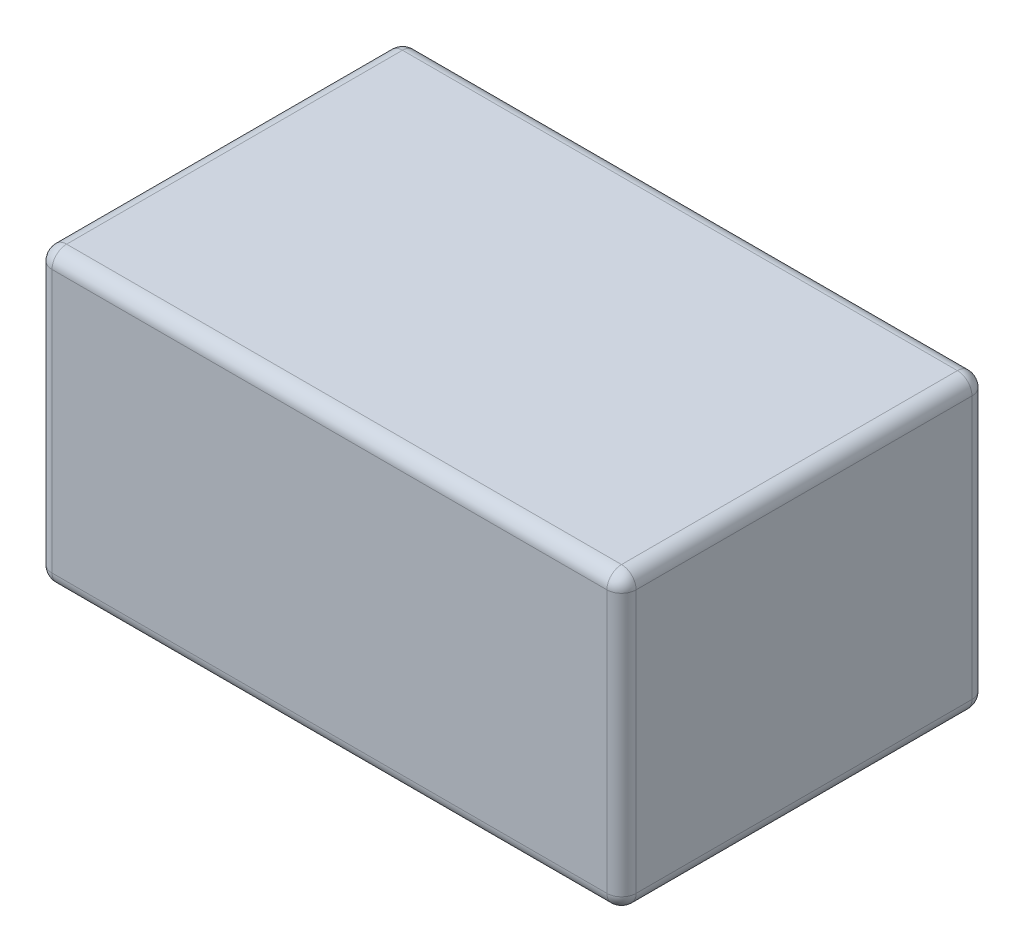
ISO-10303-21;
HEADER;
FILE_DESCRIPTION(('STEP AP214'),'2;1');
FILE_NAME('part.step','',(''),(''),'','','');
FILE_SCHEMA(('AUTOMOTIVE_DESIGN { 1 0 10303 214 1 1 1 1 }'));
ENDSEC;
DATA;
#1=APPLICATION_CONTEXT('core data for automotive mechanical design processes');
#2=APPLICATION_PROTOCOL_DEFINITION('international standard','automotive_design',2000,#1);
#3=PRODUCT_CONTEXT('',#1,'mechanical');
#4=PRODUCT('Part','Part','',(#3));
#5=PRODUCT_RELATED_PRODUCT_CATEGORY('part','',(#4));
#6=PRODUCT_DEFINITION_FORMATION('','',#4);
#7=PRODUCT_DEFINITION_CONTEXT('part definition',#1,'design');
#8=PRODUCT_DEFINITION('design','',#6,#7);
#9=PRODUCT_DEFINITION_SHAPE('','',#8);
#10=(LENGTH_UNIT() NAMED_UNIT(*) SI_UNIT(.MILLI.,.METRE.));
#11=(NAMED_UNIT(*) PLANE_ANGLE_UNIT() SI_UNIT($,.RADIAN.));
#12=(NAMED_UNIT(*) SI_UNIT($,.STERADIAN.) SOLID_ANGLE_UNIT());
#13=UNCERTAINTY_MEASURE_WITH_UNIT(LENGTH_MEASURE(1.E-05),#10,'distance_accuracy_value','');
#14=(GEOMETRIC_REPRESENTATION_CONTEXT(3) GLOBAL_UNCERTAINTY_ASSIGNED_CONTEXT((#13)) GLOBAL_UNIT_ASSIGNED_CONTEXT((#10,
#11,#12)) REPRESENTATION_CONTEXT('',''));
#15=CARTESIAN_POINT('',(0.,0.,0.));
#16=DIRECTION('',(0.,0.,1.));
#17=DIRECTION('',(1.,0.,0.));
#18=AXIS2_PLACEMENT_3D('',#15,#16,#17);
#19=CARTESIAN_POINT('',(40.,40.,-25.));
#20=DIRECTION('',(-1.,0.,0.));
#21=DIRECTION('',(0.,0.,1.));
#22=AXIS2_PLACEMENT_3D('',#19,#20,#21);
#23=PLANE('',#22);
#24=DIRECTION('',(0.,0.,-1.));
#25=VECTOR('',#24,1.);
#26=CARTESIAN_POINT('',(40.,2.,-25.));
#27=LINE('',#26,#25);
#28=CARTESIAN_POINT('',(40.,2.,23.));
#29=VERTEX_POINT('',#28);
#30=CARTESIAN_POINT('',(40.,2.,-23.));
#31=VERTEX_POINT('',#30);
#32=EDGE_CURVE('E169',#29,#31,#27,.T.);
#33=ORIENTED_EDGE('',*,*,#32,.T.);
#34=DIRECTION('',(0.,-1.,0.));
#35=VECTOR('',#34,1.);
#36=CARTESIAN_POINT('',(40.,40.,-23.));
#37=LINE('',#36,#35);
#38=CARTESIAN_POINT('',(40.,38.,-23.));
#39=VERTEX_POINT('',#38);
#40=EDGE_CURVE('E171',#31,#39,#37,.F.);
#41=ORIENTED_EDGE('',*,*,#40,.T.);
#42=DIRECTION('',(0.,0.,-1.));
#43=VECTOR('',#42,1.);
#44=CARTESIAN_POINT('',(40.,38.,25.));
#45=LINE('',#44,#43);
#46=CARTESIAN_POINT('',(40.,38.,23.));
#47=VERTEX_POINT('',#46);
#48=EDGE_CURVE('E165',#39,#47,#45,.F.);
#49=ORIENTED_EDGE('',*,*,#48,.T.);
#50=DIRECTION('',(0.,-1.,0.));
#51=VECTOR('',#50,1.);
#52=CARTESIAN_POINT('',(40.,40.,23.));
#53=LINE('',#52,#51);
#54=EDGE_CURVE('E167',#47,#29,#53,.T.);
#55=ORIENTED_EDGE('',*,*,#54,.T.);
#56=EDGE_LOOP('',(#33,#41,#49,#55));
#57=FACE_BOUND('',#56,.T.);
#58=ADVANCED_FACE('F34',(#57),#23,.F.);
#59=CARTESIAN_POINT('',(-40.,40.,-25.));
#60=DIRECTION('',(0.,0.,1.));
#61=DIRECTION('',(1.,0.,0.));
#62=AXIS2_PLACEMENT_3D('',#59,#60,#61);
#63=PLANE('',#62);
#64=DIRECTION('',(-1.,0.,0.));
#65=VECTOR('',#64,1.);
#66=CARTESIAN_POINT('',(40.,38.,-25.));
#67=LINE('',#66,#65);
#68=CARTESIAN_POINT('',(-38.,38.,-25.));
#69=VERTEX_POINT('',#68);
#70=CARTESIAN_POINT('',(38.,38.,-25.));
#71=VERTEX_POINT('',#70);
#72=EDGE_CURVE('E126',#69,#71,#67,.F.);
#73=ORIENTED_EDGE('',*,*,#72,.T.);
#74=DIRECTION('',(0.,-1.,0.));
#75=VECTOR('',#74,1.);
#76=CARTESIAN_POINT('',(38.,40.,-25.));
#77=LINE('',#76,#75);
#78=CARTESIAN_POINT('',(38.,2.,-25.));
#79=VERTEX_POINT('',#78);
#80=EDGE_CURVE('E163',#71,#79,#77,.T.);
#81=ORIENTED_EDGE('',*,*,#80,.T.);
#82=DIRECTION('',(-1.,0.,0.));
#83=VECTOR('',#82,1.);
#84=CARTESIAN_POINT('',(-40.,2.,-25.));
#85=LINE('',#84,#83);
#86=CARTESIAN_POINT('',(-38.,2.,-25.));
#87=VERTEX_POINT('',#86);
#88=EDGE_CURVE('E129',#79,#87,#85,.T.);
#89=ORIENTED_EDGE('',*,*,#88,.T.);
#90=DIRECTION('',(0.,-1.,0.));
#91=VECTOR('',#90,1.);
#92=CARTESIAN_POINT('',(-38.,40.,-25.));
#93=LINE('',#92,#91);
#94=EDGE_CURVE('E121',#87,#69,#93,.F.);
#95=ORIENTED_EDGE('',*,*,#94,.T.);
#96=EDGE_LOOP('',(#73,#81,#89,#95));
#97=FACE_BOUND('',#96,.T.);
#98=ADVANCED_FACE('F123',(#97),#63,.F.);
#99=CARTESIAN_POINT('',(-40.,40.,-25.));
#100=DIRECTION('',(1.,0.,0.));
#101=DIRECTION('',(0.,0.,-1.));
#102=AXIS2_PLACEMENT_3D('',#99,#100,#101);
#103=PLANE('',#102);
#104=DIRECTION('',(0.,0.,1.));
#105=VECTOR('',#104,1.);
#106=CARTESIAN_POINT('',(-40.,38.,-25.));
#107=LINE('',#106,#105);
#108=CARTESIAN_POINT('',(-40.,38.,23.));
#109=VERTEX_POINT('',#108);
#110=CARTESIAN_POINT('',(-40.,38.,-23.));
#111=VERTEX_POINT('',#110);
#112=EDGE_CURVE('E183',#109,#111,#107,.F.);
#113=ORIENTED_EDGE('',*,*,#112,.T.);
#114=DIRECTION('',(0.,-1.,0.));
#115=VECTOR('',#114,1.);
#116=CARTESIAN_POINT('',(-40.,40.,-23.));
#117=LINE('',#116,#115);
#118=CARTESIAN_POINT('',(-40.,2.,-23.));
#119=VERTEX_POINT('',#118);
#120=EDGE_CURVE('E140',#111,#119,#117,.T.);
#121=ORIENTED_EDGE('',*,*,#120,.T.);
#122=DIRECTION('',(0.,0.,1.));
#123=VECTOR('',#122,1.);
#124=CARTESIAN_POINT('',(-40.,2.,-25.));
#125=LINE('',#124,#123);
#126=CARTESIAN_POINT('',(-40.,2.,23.));
#127=VERTEX_POINT('',#126);
#128=EDGE_CURVE('E187',#119,#127,#125,.T.);
#129=ORIENTED_EDGE('',*,*,#128,.T.);
#130=DIRECTION('',(0.,-1.,0.));
#131=VECTOR('',#130,1.);
#132=CARTESIAN_POINT('',(-40.,40.,23.));
#133=LINE('',#132,#131);
#134=EDGE_CURVE('E185',#127,#109,#133,.F.);
#135=ORIENTED_EDGE('',*,*,#134,.T.);
#136=EDGE_LOOP('',(#113,#121,#129,#135));
#137=FACE_BOUND('',#136,.T.);
#138=ADVANCED_FACE('F325',(#137),#103,.F.);
#139=CARTESIAN_POINT('',(-40.,40.,25.));
#140=DIRECTION('',(0.,0.,-1.));
#141=DIRECTION('',(-1.,0.,0.));
#142=AXIS2_PLACEMENT_3D('',#139,#140,#141);
#143=PLANE('',#142);
#144=DIRECTION('',(0.,-1.,0.));
#145=VECTOR('',#144,1.);
#146=CARTESIAN_POINT('',(-38.,40.,25.));
#147=LINE('',#146,#145);
#148=CARTESIAN_POINT('',(-38.,38.,25.));
#149=VERTEX_POINT('',#148);
#150=CARTESIAN_POINT('',(-38.,2.,25.));
#151=VERTEX_POINT('',#150);
#152=EDGE_CURVE('E194',#149,#151,#147,.T.);
#153=ORIENTED_EDGE('',*,*,#152,.T.);
#154=DIRECTION('',(1.,0.,0.));
#155=VECTOR('',#154,1.);
#156=CARTESIAN_POINT('',(-40.,2.,25.));
#157=LINE('',#156,#155);
#158=CARTESIAN_POINT('',(38.,2.,25.));
#159=VERTEX_POINT('',#158);
#160=EDGE_CURVE('E197',#151,#159,#157,.T.);
#161=ORIENTED_EDGE('',*,*,#160,.T.);
#162=DIRECTION('',(0.,-1.,0.));
#163=VECTOR('',#162,1.);
#164=CARTESIAN_POINT('',(38.,40.,25.));
#165=LINE('',#164,#163);
#166=CARTESIAN_POINT('',(38.,38.,25.));
#167=VERTEX_POINT('',#166);
#168=EDGE_CURVE('E192',#159,#167,#165,.F.);
#169=ORIENTED_EDGE('',*,*,#168,.T.);
#170=DIRECTION('',(1.,0.,0.));
#171=VECTOR('',#170,1.);
#172=CARTESIAN_POINT('',(-40.,38.,25.));
#173=LINE('',#172,#171);
#174=EDGE_CURVE('E190',#167,#149,#173,.F.);
#175=ORIENTED_EDGE('',*,*,#174,.T.);
#176=EDGE_LOOP('',(#153,#161,#169,#175));
#177=FACE_BOUND('',#176,.T.);
#178=ADVANCED_FACE('F274',(#177),#143,.F.);
#179=CARTESIAN_POINT('',(0.,40.,0.));
#180=DIRECTION('',(0.,1.,0.));
#181=DIRECTION('',(0.,0.,1.));
#182=AXIS2_PLACEMENT_3D('',#179,#180,#181);
#183=PLANE('',#182);
#184=DIRECTION('',(0.,0.,1.));
#185=VECTOR('',#184,1.);
#186=CARTESIAN_POINT('',(-38.,40.,25.));
#187=LINE('',#186,#185);
#188=CARTESIAN_POINT('',(-38.,40.,-23.));
#189=VERTEX_POINT('',#188);
#190=CARTESIAN_POINT('',(-38.,40.,23.));
#191=VERTEX_POINT('',#190);
#192=EDGE_CURVE('E43',#189,#191,#187,.T.);
#193=ORIENTED_EDGE('',*,*,#192,.T.);
#194=DIRECTION('',(1.,0.,0.));
#195=VECTOR('',#194,1.);
#196=CARTESIAN_POINT('',(40.,40.,23.));
#197=LINE('',#196,#195);
#198=CARTESIAN_POINT('',(38.,40.,23.));
#199=VERTEX_POINT('',#198);
#200=EDGE_CURVE('E11',#191,#199,#197,.T.);
#201=ORIENTED_EDGE('',*,*,#200,.T.);
#202=DIRECTION('',(0.,0.,-1.));
#203=VECTOR('',#202,1.);
#204=CARTESIAN_POINT('',(38.,40.,-25.));
#205=LINE('',#204,#203);
#206=CARTESIAN_POINT('',(38.,40.,-23.));
#207=VERTEX_POINT('',#206);
#208=EDGE_CURVE('E199',#199,#207,#205,.T.);
#209=ORIENTED_EDGE('',*,*,#208,.T.);
#210=DIRECTION('',(-1.,0.,0.));
#211=VECTOR('',#210,1.);
#212=CARTESIAN_POINT('',(-40.,40.,-23.));
#213=LINE('',#212,#211);
#214=EDGE_CURVE('E54',#207,#189,#213,.T.);
#215=ORIENTED_EDGE('',*,*,#214,.T.);
#216=EDGE_LOOP('',(#193,#201,#209,#215));
#217=FACE_BOUND('',#216,.T.);
#218=ADVANCED_FACE('F289',(#217),#183,.T.);
#219=CARTESIAN_POINT('',(0.,0.,0.));
#220=DIRECTION('',(0.,1.,0.));
#221=DIRECTION('',(0.,0.,1.));
#222=AXIS2_PLACEMENT_3D('',#219,#220,#221);
#223=PLANE('',#222);
#224=DIRECTION('',(0.,0.,1.));
#225=VECTOR('',#224,1.);
#226=CARTESIAN_POINT('',(-38.,0.,0.));
#227=LINE('',#226,#225);
#228=CARTESIAN_POINT('',(-38.,0.,23.));
#229=VERTEX_POINT('',#228);
#230=CARTESIAN_POINT('',(-38.,0.,-23.));
#231=VERTEX_POINT('',#230);
#232=EDGE_CURVE('E176',#229,#231,#227,.F.);
#233=ORIENTED_EDGE('',*,*,#232,.T.);
#234=DIRECTION('',(-1.,0.,0.));
#235=VECTOR('',#234,1.);
#236=CARTESIAN_POINT('',(0.,0.,-23.));
#237=LINE('',#236,#235);
#238=CARTESIAN_POINT('',(38.,0.,-23.));
#239=VERTEX_POINT('',#238);
#240=EDGE_CURVE('E180',#231,#239,#237,.F.);
#241=ORIENTED_EDGE('',*,*,#240,.T.);
#242=DIRECTION('',(0.,0.,-1.));
#243=VECTOR('',#242,1.);
#244=CARTESIAN_POINT('',(38.,0.,0.));
#245=LINE('',#244,#243);
#246=CARTESIAN_POINT('',(38.,0.,23.));
#247=VERTEX_POINT('',#246);
#248=EDGE_CURVE('E178',#239,#247,#245,.F.);
#249=ORIENTED_EDGE('',*,*,#248,.T.);
#250=DIRECTION('',(1.,0.,0.));
#251=VECTOR('',#250,1.);
#252=CARTESIAN_POINT('',(0.,0.,23.));
#253=LINE('',#252,#251);
#254=EDGE_CURVE('E174',#247,#229,#253,.F.);
#255=ORIENTED_EDGE('',*,*,#254,.T.);
#256=EDGE_LOOP('',(#233,#241,#249,#255));
#257=FACE_BOUND('',#256,.T.);
#258=ADVANCED_FACE('F265',(#257),#223,.F.);
#259=CARTESIAN_POINT('',(-38.,40.,23.));
#260=DIRECTION('',(0.,-1.,0.));
#261=DIRECTION('',(0.,0.,-1.));
#262=AXIS2_PLACEMENT_3D('',#259,#260,#261);
#263=CYLINDRICAL_SURFACE('',#262,2.);
#264=CARTESIAN_POINT('',(-38.,38.,23.));
#265=DIRECTION('',(0.,1.,0.));
#266=DIRECTION('',(0.,0.,1.));
#267=AXIS2_PLACEMENT_3D('',#264,#265,#266);
#268=CIRCLE('',#267,2.);
#269=EDGE_CURVE('E38',#109,#149,#268,.T.);
#270=ORIENTED_EDGE('',*,*,#269,.F.);
#271=ORIENTED_EDGE('',*,*,#134,.F.);
#272=CARTESIAN_POINT('',(-38.,2.,23.));
#273=DIRECTION('',(0.,-1.,0.));
#274=DIRECTION('',(0.,0.,-1.));
#275=AXIS2_PLACEMENT_3D('',#272,#273,#274);
#276=CIRCLE('',#275,2.);
#277=EDGE_CURVE('E160',#151,#127,#276,.T.);
#278=ORIENTED_EDGE('',*,*,#277,.F.);
#279=ORIENTED_EDGE('',*,*,#152,.F.);
#280=EDGE_LOOP('',(#270,#271,#278,#279));
#281=FACE_BOUND('',#280,.T.);
#282=ADVANCED_FACE('F36',(#281),#263,.T.);
#283=CARTESIAN_POINT('',(-38.,38.,23.));
#284=DIRECTION('',(0.,0.,1.));
#285=DIRECTION('',(1.,0.,0.));
#286=AXIS2_PLACEMENT_3D('',#283,#284,#285);
#287=SPHERICAL_SURFACE('',#286,2.);
#288=CARTESIAN_POINT('',(-38.,38.,23.));
#289=DIRECTION('',(0.,0.,1.));
#290=DIRECTION('',(1.,0.,0.));
#291=AXIS2_PLACEMENT_3D('',#288,#289,#290);
#292=CIRCLE('',#291,2.);
#293=EDGE_CURVE('E245',#109,#191,#292,.F.);
#294=ORIENTED_EDGE('',*,*,#293,.F.);
#295=ORIENTED_EDGE('',*,*,#269,.T.);
#296=CARTESIAN_POINT('',(-38.,38.,23.));
#297=DIRECTION('',(-1.,0.,0.));
#298=DIRECTION('',(0.,0.,1.));
#299=AXIS2_PLACEMENT_3D('',#296,#297,#298);
#300=CIRCLE('',#299,2.);
#301=EDGE_CURVE('E247',#191,#149,#300,.F.);
#302=ORIENTED_EDGE('',*,*,#301,.F.);
#303=EDGE_LOOP('',(#294,#295,#302));
#304=FACE_BOUND('',#303,.T.);
#305=ADVANCED_FACE('F458',(#304),#287,.T.);
#306=CARTESIAN_POINT('',(-38.,2.,23.));
#307=DIRECTION('',(0.,0.,1.));
#308=DIRECTION('',(1.,0.,0.));
#309=AXIS2_PLACEMENT_3D('',#306,#307,#308);
#310=SPHERICAL_SURFACE('',#309,2.);
#311=CARTESIAN_POINT('',(-38.,2.,23.));
#312=DIRECTION('',(-1.,0.,0.));
#313=DIRECTION('',(0.,0.,1.));
#314=AXIS2_PLACEMENT_3D('',#311,#312,#313);
#315=CIRCLE('',#314,2.);
#316=EDGE_CURVE('E239',#151,#229,#315,.F.);
#317=ORIENTED_EDGE('',*,*,#316,.F.);
#318=ORIENTED_EDGE('',*,*,#277,.T.);
#319=CARTESIAN_POINT('',(-38.,2.,23.));
#320=DIRECTION('',(0.,0.,1.));
#321=DIRECTION('',(1.,0.,0.));
#322=AXIS2_PLACEMENT_3D('',#319,#320,#321);
#323=CIRCLE('',#322,2.);
#324=EDGE_CURVE('E242',#229,#127,#323,.F.);
#325=ORIENTED_EDGE('',*,*,#324,.F.);
#326=EDGE_LOOP('',(#317,#318,#325));
#327=FACE_BOUND('',#326,.T.);
#328=ADVANCED_FACE('F254',(#327),#310,.T.);
#329=CARTESIAN_POINT('',(0.,38.,23.));
#330=DIRECTION('',(-1.,0.,0.));
#331=DIRECTION('',(0.,0.,1.));
#332=AXIS2_PLACEMENT_3D('',#329,#330,#331);
#333=CYLINDRICAL_SURFACE('',#332,2.);
#334=ORIENTED_EDGE('',*,*,#301,.T.);
#335=ORIENTED_EDGE('',*,*,#174,.F.);
#336=CARTESIAN_POINT('',(38.,38.,23.));
#337=DIRECTION('',(1.,0.,0.));
#338=DIRECTION('',(0.,0.,-1.));
#339=AXIS2_PLACEMENT_3D('',#336,#337,#338);
#340=CIRCLE('',#339,2.);
#341=EDGE_CURVE('E233',#199,#167,#340,.T.);
#342=ORIENTED_EDGE('',*,*,#341,.F.);
#343=ORIENTED_EDGE('',*,*,#200,.F.);
#344=EDGE_LOOP('',(#334,#335,#342,#343));
#345=FACE_BOUND('',#344,.T.);
#346=ADVANCED_FACE('F288',(#345),#333,.T.);
#347=CARTESIAN_POINT('',(-38.,38.,0.));
#348=DIRECTION('',(0.,0.,-1.));
#349=DIRECTION('',(-1.,0.,0.));
#350=AXIS2_PLACEMENT_3D('',#347,#348,#349);
#351=CYLINDRICAL_SURFACE('',#350,2.);
#352=ORIENTED_EDGE('',*,*,#293,.T.);
#353=ORIENTED_EDGE('',*,*,#192,.F.);
#354=CARTESIAN_POINT('',(-38.,38.,-23.));
#355=DIRECTION('',(0.,0.,-1.));
#356=DIRECTION('',(-1.,0.,0.));
#357=AXIS2_PLACEMENT_3D('',#354,#355,#356);
#358=CIRCLE('',#357,2.);
#359=EDGE_CURVE('E144',#111,#189,#358,.T.);
#360=ORIENTED_EDGE('',*,*,#359,.F.);
#361=ORIENTED_EDGE('',*,*,#112,.F.);
#362=EDGE_LOOP('',(#352,#353,#360,#361));
#363=FACE_BOUND('',#362,.T.);
#364=ADVANCED_FACE('F435',(#363),#351,.T.);
#365=CARTESIAN_POINT('',(-38.,40.,-23.));
#366=DIRECTION('',(0.,-1.,0.));
#367=DIRECTION('',(0.,0.,-1.));
#368=AXIS2_PLACEMENT_3D('',#365,#366,#367);
#369=CYLINDRICAL_SURFACE('',#368,2.);
#370=CARTESIAN_POINT('',(-38.,2.,-23.));
#371=DIRECTION('',(0.,-1.,0.));
#372=DIRECTION('',(0.,0.,-1.));
#373=AXIS2_PLACEMENT_3D('',#370,#371,#372);
#374=CIRCLE('',#373,2.);
#375=EDGE_CURVE('E145',#119,#87,#374,.T.);
#376=ORIENTED_EDGE('',*,*,#375,.F.);
#377=ORIENTED_EDGE('',*,*,#120,.F.);
#378=CARTESIAN_POINT('',(-38.,38.,-23.));
#379=DIRECTION('',(0.,1.,0.));
#380=DIRECTION('',(0.,0.,1.));
#381=AXIS2_PLACEMENT_3D('',#378,#379,#380);
#382=CIRCLE('',#381,2.);
#383=EDGE_CURVE('E136',#69,#111,#382,.T.);
#384=ORIENTED_EDGE('',*,*,#383,.F.);
#385=ORIENTED_EDGE('',*,*,#94,.F.);
#386=EDGE_LOOP('',(#376,#377,#384,#385));
#387=FACE_BOUND('',#386,.T.);
#388=ADVANCED_FACE('F138',(#387),#369,.T.);
#389=CARTESIAN_POINT('',(-38.,2.,-25.));
#390=DIRECTION('',(0.,0.,1.));
#391=DIRECTION('',(1.,0.,0.));
#392=AXIS2_PLACEMENT_3D('',#389,#390,#391);
#393=CYLINDRICAL_SURFACE('',#392,2.);
#394=ORIENTED_EDGE('',*,*,#324,.T.);
#395=ORIENTED_EDGE('',*,*,#128,.F.);
#396=CARTESIAN_POINT('',(-38.,2.,-23.));
#397=DIRECTION('',(0.,0.,-1.));
#398=DIRECTION('',(-1.,0.,0.));
#399=AXIS2_PLACEMENT_3D('',#396,#397,#398);
#400=CIRCLE('',#399,2.);
#401=EDGE_CURVE('E229',#231,#119,#400,.T.);
#402=ORIENTED_EDGE('',*,*,#401,.F.);
#403=ORIENTED_EDGE('',*,*,#232,.F.);
#404=EDGE_LOOP('',(#394,#395,#402,#403));
#405=FACE_BOUND('',#404,.T.);
#406=ADVANCED_FACE('F261',(#405),#393,.T.);
#407=CARTESIAN_POINT('',(-40.,2.,23.));
#408=DIRECTION('',(1.,0.,0.));
#409=DIRECTION('',(0.,0.,-1.));
#410=AXIS2_PLACEMENT_3D('',#407,#408,#409);
#411=CYLINDRICAL_SURFACE('',#410,2.);
#412=ORIENTED_EDGE('',*,*,#316,.T.);
#413=ORIENTED_EDGE('',*,*,#254,.F.);
#414=CARTESIAN_POINT('',(38.,2.,23.));
#415=DIRECTION('',(1.,0.,0.));
#416=DIRECTION('',(0.,0.,-1.));
#417=AXIS2_PLACEMENT_3D('',#414,#415,#416);
#418=CIRCLE('',#417,2.);
#419=EDGE_CURVE('E226',#159,#247,#418,.T.);
#420=ORIENTED_EDGE('',*,*,#419,.F.);
#421=ORIENTED_EDGE('',*,*,#160,.F.);
#422=EDGE_LOOP('',(#412,#413,#420,#421));
#423=FACE_BOUND('',#422,.T.);
#424=ADVANCED_FACE('F271',(#423),#411,.T.);
#425=CARTESIAN_POINT('',(38.,40.,23.));
#426=DIRECTION('',(0.,-1.,0.));
#427=DIRECTION('',(0.,0.,-1.));
#428=AXIS2_PLACEMENT_3D('',#425,#426,#427);
#429=CYLINDRICAL_SURFACE('',#428,2.);
#430=CARTESIAN_POINT('',(38.,38.,23.));
#431=DIRECTION('',(0.,1.,0.));
#432=DIRECTION('',(0.,0.,1.));
#433=AXIS2_PLACEMENT_3D('',#430,#431,#432);
#434=CIRCLE('',#433,2.);
#435=EDGE_CURVE('E236',#167,#47,#434,.T.);
#436=ORIENTED_EDGE('',*,*,#435,.F.);
#437=ORIENTED_EDGE('',*,*,#168,.F.);
#438=CARTESIAN_POINT('',(38.,2.,23.));
#439=DIRECTION('',(0.,-1.,0.));
#440=DIRECTION('',(0.,0.,-1.));
#441=AXIS2_PLACEMENT_3D('',#438,#439,#440);
#442=CIRCLE('',#441,2.);
#443=EDGE_CURVE('E223',#29,#159,#442,.T.);
#444=ORIENTED_EDGE('',*,*,#443,.F.);
#445=ORIENTED_EDGE('',*,*,#54,.F.);
#446=EDGE_LOOP('',(#436,#437,#444,#445));
#447=FACE_BOUND('',#446,.T.);
#448=ADVANCED_FACE('F279',(#447),#429,.T.);
#449=CARTESIAN_POINT('',(38.,38.,23.));
#450=DIRECTION('',(0.,0.,1.));
#451=DIRECTION('',(1.,0.,0.));
#452=AXIS2_PLACEMENT_3D('',#449,#450,#451);
#453=SPHERICAL_SURFACE('',#452,2.);
#454=ORIENTED_EDGE('',*,*,#341,.T.);
#455=ORIENTED_EDGE('',*,*,#435,.T.);
#456=CARTESIAN_POINT('',(38.,38.,23.));
#457=DIRECTION('',(0.,0.,1.));
#458=DIRECTION('',(1.,0.,0.));
#459=AXIS2_PLACEMENT_3D('',#456,#457,#458);
#460=CIRCLE('',#459,2.);
#461=EDGE_CURVE('E151',#199,#47,#460,.F.);
#462=ORIENTED_EDGE('',*,*,#461,.F.);
#463=EDGE_LOOP('',(#454,#455,#462));
#464=FACE_BOUND('',#463,.T.);
#465=ADVANCED_FACE('F285',(#464),#453,.T.);
#466=CARTESIAN_POINT('',(-38.,38.,-23.));
#467=DIRECTION('',(0.,0.,1.));
#468=DIRECTION('',(1.,0.,0.));
#469=AXIS2_PLACEMENT_3D('',#466,#467,#468);
#470=SPHERICAL_SURFACE('',#469,2.);
#471=ORIENTED_EDGE('',*,*,#383,.T.);
#472=ORIENTED_EDGE('',*,*,#359,.T.);
#473=CARTESIAN_POINT('',(-38.,38.,-23.));
#474=DIRECTION('',(-1.,0.,0.));
#475=DIRECTION('',(0.,0.,1.));
#476=AXIS2_PLACEMENT_3D('',#473,#474,#475);
#477=CIRCLE('',#476,2.);
#478=EDGE_CURVE('E148',#69,#189,#477,.F.);
#479=ORIENTED_EDGE('',*,*,#478,.F.);
#480=EDGE_LOOP('',(#471,#472,#479));
#481=FACE_BOUND('',#480,.T.);
#482=ADVANCED_FACE('F149',(#481),#470,.T.);
#483=CARTESIAN_POINT('',(-38.,2.,-23.));
#484=DIRECTION('',(0.,0.,1.));
#485=DIRECTION('',(1.,0.,0.));
#486=AXIS2_PLACEMENT_3D('',#483,#484,#485);
#487=SPHERICAL_SURFACE('',#486,2.);
#488=ORIENTED_EDGE('',*,*,#401,.T.);
#489=ORIENTED_EDGE('',*,*,#375,.T.);
#490=CARTESIAN_POINT('',(-38.,2.,-23.));
#491=DIRECTION('',(-1.,0.,0.));
#492=DIRECTION('',(0.,0.,1.));
#493=AXIS2_PLACEMENT_3D('',#490,#491,#492);
#494=CIRCLE('',#493,2.);
#495=EDGE_CURVE('E152',#231,#87,#494,.F.);
#496=ORIENTED_EDGE('',*,*,#495,.F.);
#497=EDGE_LOOP('',(#488,#489,#496));
#498=FACE_BOUND('',#497,.T.);
#499=ADVANCED_FACE('F308',(#498),#487,.T.);
#500=CARTESIAN_POINT('',(38.,2.,23.));
#501=DIRECTION('',(0.,0.,1.));
#502=DIRECTION('',(1.,0.,0.));
#503=AXIS2_PLACEMENT_3D('',#500,#501,#502);
#504=SPHERICAL_SURFACE('',#503,2.);
#505=ORIENTED_EDGE('',*,*,#443,.T.);
#506=ORIENTED_EDGE('',*,*,#419,.T.);
#507=CARTESIAN_POINT('',(38.,2.,23.));
#508=DIRECTION('',(0.,0.,1.));
#509=DIRECTION('',(1.,0.,0.));
#510=AXIS2_PLACEMENT_3D('',#507,#508,#509);
#511=CIRCLE('',#510,2.);
#512=EDGE_CURVE('E216',#29,#247,#511,.F.);
#513=ORIENTED_EDGE('',*,*,#512,.F.);
#514=EDGE_LOOP('',(#505,#506,#513));
#515=FACE_BOUND('',#514,.T.);
#516=ADVANCED_FACE('F310',(#515),#504,.T.);
#517=CARTESIAN_POINT('',(38.,38.,0.));
#518=DIRECTION('',(0.,0.,1.));
#519=DIRECTION('',(1.,0.,0.));
#520=AXIS2_PLACEMENT_3D('',#517,#518,#519);
#521=CYLINDRICAL_SURFACE('',#520,2.);
#522=ORIENTED_EDGE('',*,*,#461,.T.);
#523=ORIENTED_EDGE('',*,*,#48,.F.);
#524=CARTESIAN_POINT('',(38.,38.,-23.));
#525=DIRECTION('',(0.,0.,-1.));
#526=DIRECTION('',(-1.,0.,0.));
#527=AXIS2_PLACEMENT_3D('',#524,#525,#526);
#528=CIRCLE('',#527,2.);
#529=EDGE_CURVE('E213',#207,#39,#528,.T.);
#530=ORIENTED_EDGE('',*,*,#529,.F.);
#531=ORIENTED_EDGE('',*,*,#208,.F.);
#532=EDGE_LOOP('',(#522,#523,#530,#531));
#533=FACE_BOUND('',#532,.T.);
#534=ADVANCED_FACE('F293',(#533),#521,.T.);
#535=CARTESIAN_POINT('',(0.,38.,-23.));
#536=DIRECTION('',(1.,0.,0.));
#537=DIRECTION('',(0.,0.,-1.));
#538=AXIS2_PLACEMENT_3D('',#535,#536,#537);
#539=CYLINDRICAL_SURFACE('',#538,2.);
#540=ORIENTED_EDGE('',*,*,#478,.T.);
#541=ORIENTED_EDGE('',*,*,#214,.F.);
#542=CARTESIAN_POINT('',(38.,38.,-23.));
#543=DIRECTION('',(1.,0.,0.));
#544=DIRECTION('',(0.,0.,-1.));
#545=AXIS2_PLACEMENT_3D('',#542,#543,#544);
#546=CIRCLE('',#545,2.);
#547=EDGE_CURVE('E156',#71,#207,#546,.T.);
#548=ORIENTED_EDGE('',*,*,#547,.F.);
#549=ORIENTED_EDGE('',*,*,#72,.F.);
#550=EDGE_LOOP('',(#540,#541,#548,#549));
#551=FACE_BOUND('',#550,.T.);
#552=ADVANCED_FACE('F154',(#551),#539,.T.);
#553=CARTESIAN_POINT('',(-40.,2.,-23.));
#554=DIRECTION('',(-1.,0.,0.));
#555=DIRECTION('',(0.,0.,1.));
#556=AXIS2_PLACEMENT_3D('',#553,#554,#555);
#557=CYLINDRICAL_SURFACE('',#556,2.);
#558=ORIENTED_EDGE('',*,*,#495,.T.);
#559=ORIENTED_EDGE('',*,*,#88,.F.);
#560=CARTESIAN_POINT('',(38.,2.,-23.));
#561=DIRECTION('',(1.,0.,0.));
#562=DIRECTION('',(0.,0.,-1.));
#563=AXIS2_PLACEMENT_3D('',#560,#561,#562);
#564=CIRCLE('',#563,2.);
#565=EDGE_CURVE('E209',#239,#79,#564,.T.);
#566=ORIENTED_EDGE('',*,*,#565,.F.);
#567=ORIENTED_EDGE('',*,*,#240,.F.);
#568=EDGE_LOOP('',(#558,#559,#566,#567));
#569=FACE_BOUND('',#568,.T.);
#570=ADVANCED_FACE('F306',(#569),#557,.T.);
#571=CARTESIAN_POINT('',(38.,2.,-25.));
#572=DIRECTION('',(0.,0.,-1.));
#573=DIRECTION('',(-1.,0.,0.));
#574=AXIS2_PLACEMENT_3D('',#571,#572,#573);
#575=CYLINDRICAL_SURFACE('',#574,2.);
#576=ORIENTED_EDGE('',*,*,#512,.T.);
#577=ORIENTED_EDGE('',*,*,#248,.F.);
#578=CARTESIAN_POINT('',(38.,2.,-23.));
#579=DIRECTION('',(0.,0.,-1.));
#580=DIRECTION('',(-1.,0.,0.));
#581=AXIS2_PLACEMENT_3D('',#578,#579,#580);
#582=CIRCLE('',#581,2.);
#583=EDGE_CURVE('E207',#31,#239,#582,.T.);
#584=ORIENTED_EDGE('',*,*,#583,.F.);
#585=ORIENTED_EDGE('',*,*,#32,.F.);
#586=EDGE_LOOP('',(#576,#577,#584,#585));
#587=FACE_BOUND('',#586,.T.);
#588=ADVANCED_FACE('F335',(#587),#575,.T.);
#589=CARTESIAN_POINT('',(38.,38.,-23.));
#590=DIRECTION('',(0.,0.,1.));
#591=DIRECTION('',(1.,0.,0.));
#592=AXIS2_PLACEMENT_3D('',#589,#590,#591);
#593=SPHERICAL_SURFACE('',#592,2.);
#594=ORIENTED_EDGE('',*,*,#547,.T.);
#595=ORIENTED_EDGE('',*,*,#529,.T.);
#596=CARTESIAN_POINT('',(38.,38.,-23.));
#597=DIRECTION('',(0.,1.,0.));
#598=DIRECTION('',(0.,0.,1.));
#599=AXIS2_PLACEMENT_3D('',#596,#597,#598);
#600=CIRCLE('',#599,2.);
#601=EDGE_CURVE('E205',#71,#39,#600,.F.);
#602=ORIENTED_EDGE('',*,*,#601,.F.);
#603=EDGE_LOOP('',(#594,#595,#602));
#604=FACE_BOUND('',#603,.T.);
#605=ADVANCED_FACE('F295',(#604),#593,.T.);
#606=CARTESIAN_POINT('',(38.,2.,-23.));
#607=DIRECTION('',(0.,0.,1.));
#608=DIRECTION('',(1.,0.,0.));
#609=AXIS2_PLACEMENT_3D('',#606,#607,#608);
#610=SPHERICAL_SURFACE('',#609,2.);
#611=ORIENTED_EDGE('',*,*,#583,.T.);
#612=ORIENTED_EDGE('',*,*,#565,.T.);
#613=CARTESIAN_POINT('',(38.,2.,-23.));
#614=DIRECTION('',(0.,-1.,0.));
#615=DIRECTION('',(0.,0.,-1.));
#616=AXIS2_PLACEMENT_3D('',#613,#614,#615);
#617=CIRCLE('',#616,2.);
#618=EDGE_CURVE('E203',#31,#79,#617,.F.);
#619=ORIENTED_EDGE('',*,*,#618,.F.);
#620=EDGE_LOOP('',(#611,#612,#619));
#621=FACE_BOUND('',#620,.T.);
#622=ADVANCED_FACE('F303',(#621),#610,.T.);
#623=CARTESIAN_POINT('',(38.,40.,-23.));
#624=DIRECTION('',(0.,-1.,0.));
#625=DIRECTION('',(0.,0.,-1.));
#626=AXIS2_PLACEMENT_3D('',#623,#624,#625);
#627=CYLINDRICAL_SURFACE('',#626,2.);
#628=ORIENTED_EDGE('',*,*,#601,.T.);
#629=ORIENTED_EDGE('',*,*,#40,.F.);
#630=ORIENTED_EDGE('',*,*,#618,.T.);
#631=ORIENTED_EDGE('',*,*,#80,.F.);
#632=EDGE_LOOP('',(#628,#629,#630,#631));
#633=FACE_BOUND('',#632,.T.);
#634=ADVANCED_FACE('F299',(#633),#627,.T.);
#635=CLOSED_SHELL('',(#58,#98,#138,#178,#218,#258,#282,#305,#328,#346,#364,#388,#406,#424,#448,
#465,#482,#499,#516,#534,#552,#570,#588,#605,#622,#634));
#636=MANIFOLD_SOLID_BREP('B2',#635);
#637=ADVANCED_BREP_SHAPE_REPRESENTATION('',(#18,#636),#14);
#638=SHAPE_DEFINITION_REPRESENTATION(#9,#637);
ENDSEC;
END-ISO-10303-21;
